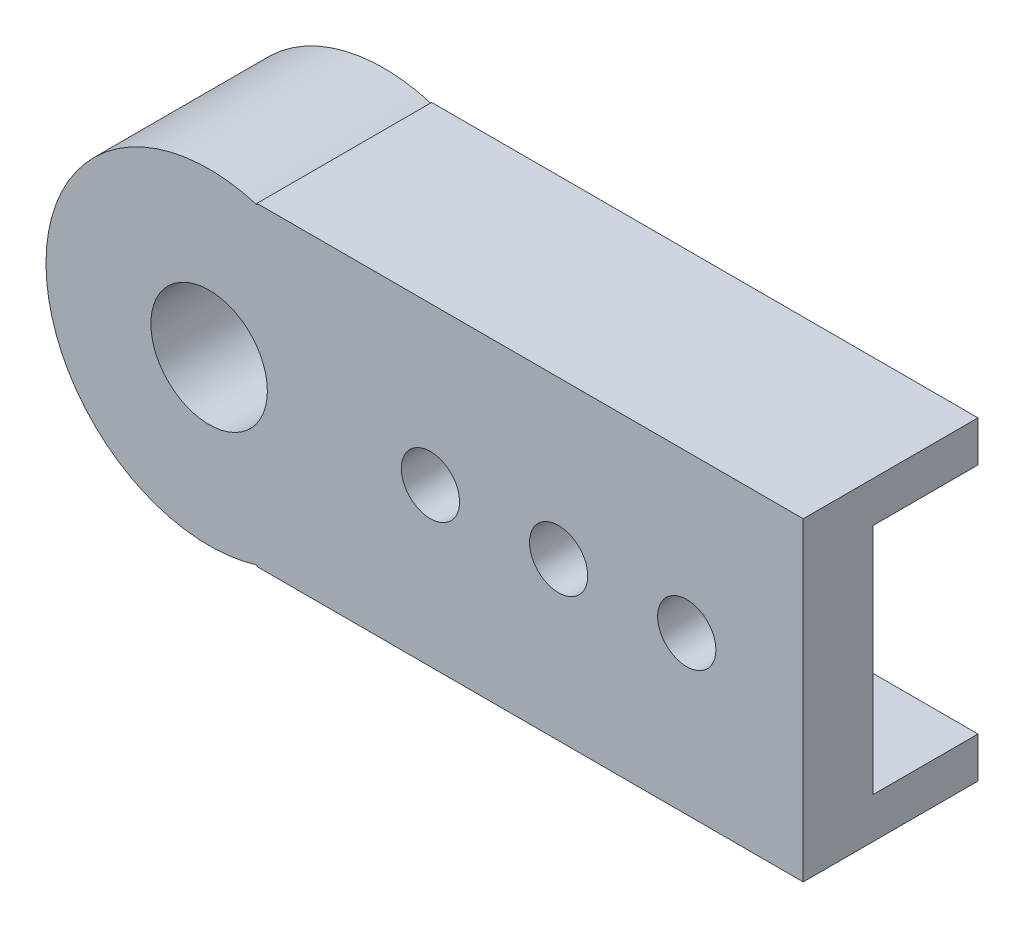
ISO-10303-21;
HEADER;
FILE_DESCRIPTION(('STEP AP214'),'2;1');
FILE_NAME('part.step','',(''),(''),'','','');
FILE_SCHEMA(('AUTOMOTIVE_DESIGN { 1 0 10303 214 1 1 1 1 }'));
ENDSEC;
DATA;
#1=APPLICATION_CONTEXT('core data for automotive mechanical design processes');
#2=APPLICATION_PROTOCOL_DEFINITION('international standard','automotive_design',2000,#1);
#3=PRODUCT_CONTEXT('',#1,'mechanical');
#4=PRODUCT('Part','Part','',(#3));
#5=PRODUCT_RELATED_PRODUCT_CATEGORY('part','',(#4));
#6=PRODUCT_DEFINITION_FORMATION('','',#4);
#7=PRODUCT_DEFINITION_CONTEXT('part definition',#1,'design');
#8=PRODUCT_DEFINITION('design','',#6,#7);
#9=PRODUCT_DEFINITION_SHAPE('','',#8);
#10=(LENGTH_UNIT() NAMED_UNIT(*) SI_UNIT(.MILLI.,.METRE.));
#11=(NAMED_UNIT(*) PLANE_ANGLE_UNIT() SI_UNIT($,.RADIAN.));
#12=(NAMED_UNIT(*) SI_UNIT($,.STERADIAN.) SOLID_ANGLE_UNIT());
#13=UNCERTAINTY_MEASURE_WITH_UNIT(LENGTH_MEASURE(1.E-05),#10,'distance_accuracy_value','');
#14=(GEOMETRIC_REPRESENTATION_CONTEXT(3) GLOBAL_UNCERTAINTY_ASSIGNED_CONTEXT((#13)) GLOBAL_UNIT_ASSIGNED_CONTEXT((#10,
#11,#12)) REPRESENTATION_CONTEXT('',''));
#15=CARTESIAN_POINT('',(0.,0.,0.));
#16=DIRECTION('',(0.,0.,1.));
#17=DIRECTION('',(1.,0.,0.));
#18=AXIS2_PLACEMENT_3D('',#15,#16,#17);
#19=CARTESIAN_POINT('',(-31.,0.,-9.));
#20=DIRECTION('',(0.,0.,1.));
#21=DIRECTION('',(1.,0.,0.));
#22=AXIS2_PLACEMENT_3D('',#19,#20,#21);
#23=CYLINDRICAL_SURFACE('',#22,11.);
#24=CARTESIAN_POINT('',(-31.,0.,-9.));
#25=DIRECTION('',(0.,0.,1.));
#26=DIRECTION('',(1.,0.,0.));
#27=AXIS2_PLACEMENT_3D('',#24,#25,#26);
#28=CIRCLE('',#27,11.);
#29=CARTESIAN_POINT('',(-20.,0.,-9.));
#30=VERTEX_POINT('',#29);
#31=EDGE_CURVE('E161',#30,#30,#28,.T.);
#32=ORIENTED_EDGE('',*,*,#31,.F.);
#33=EDGE_LOOP('',(#32));
#34=FACE_BOUND('',#33,.T.);
#35=CARTESIAN_POINT('',(-31.,0.,-2.));
#36=DIRECTION('',(0.,0.,1.));
#37=DIRECTION('',(1.,0.,0.));
#38=AXIS2_PLACEMENT_3D('',#35,#36,#37);
#39=CIRCLE('',#38,11.);
#40=CARTESIAN_POINT('',(-20.,0.,-2.));
#41=VERTEX_POINT('',#40);
#42=EDGE_CURVE('E11',#41,#41,#39,.F.);
#43=ORIENTED_EDGE('',*,*,#42,.F.);
#44=EDGE_LOOP('',(#43));
#45=FACE_BOUND('',#44,.T.);
#46=ADVANCED_FACE('F45',(#34,#45),#23,.F.);
#47=CARTESIAN_POINT('',(20.,-10.,6.));
#48=DIRECTION('',(-1.,0.,0.));
#49=DIRECTION('',(0.,0.,1.));
#50=AXIS2_PLACEMENT_3D('',#47,#48,#49);
#51=PLANE('',#50);
#52=DIRECTION('',(0.,1.,0.));
#53=VECTOR('',#52,1.);
#54=CARTESIAN_POINT('',(20.,-10.,0.));
#55=LINE('',#54,#53);
#56=CARTESIAN_POINT('',(20.,-10.,0.));
#57=VERTEX_POINT('',#56);
#58=CARTESIAN_POINT('',(20.,10.,0.));
#59=VERTEX_POINT('',#58);
#60=EDGE_CURVE('E293',#57,#59,#55,.T.);
#61=ORIENTED_EDGE('',*,*,#60,.T.);
#62=DIRECTION('',(0.,0.,1.));
#63=VECTOR('',#62,1.);
#64=CARTESIAN_POINT('',(20.,10.,-9.));
#65=LINE('',#64,#63);
#66=CARTESIAN_POINT('',(20.,10.,-9.));
#67=VERTEX_POINT('',#66);
#68=EDGE_CURVE('E254',#67,#59,#65,.T.);
#69=ORIENTED_EDGE('',*,*,#68,.F.);
#70=DIRECTION('',(0.,-1.,0.));
#71=VECTOR('',#70,1.);
#72=CARTESIAN_POINT('',(20.,0.,-9.));
#73=LINE('',#72,#71);
#74=CARTESIAN_POINT('',(20.,13.5,-9.));
#75=VERTEX_POINT('',#74);
#76=EDGE_CURVE('E171',#75,#67,#73,.T.);
#77=ORIENTED_EDGE('',*,*,#76,.F.);
#78=DIRECTION('',(0.,0.,1.));
#79=VECTOR('',#78,1.);
#80=CARTESIAN_POINT('',(20.,13.5,-9.));
#81=LINE('',#80,#79);
#82=CARTESIAN_POINT('',(20.,13.5,6.));
#83=VERTEX_POINT('',#82);
#84=EDGE_CURVE('E250',#75,#83,#81,.T.);
#85=ORIENTED_EDGE('',*,*,#84,.T.);
#86=DIRECTION('',(0.,1.,0.));
#87=VECTOR('',#86,1.);
#88=CARTESIAN_POINT('',(20.,-10.,6.));
#89=LINE('',#88,#87);
#90=CARTESIAN_POINT('',(20.,-13.5,6.));
#91=VERTEX_POINT('',#90);
#92=EDGE_CURVE('E283',#91,#83,#89,.T.);
#93=ORIENTED_EDGE('',*,*,#92,.F.);
#94=DIRECTION('',(0.,0.,1.));
#95=VECTOR('',#94,1.);
#96=CARTESIAN_POINT('',(20.,-13.5,-9.));
#97=LINE('',#96,#95);
#98=CARTESIAN_POINT('',(20.,-13.5,-9.));
#99=VERTEX_POINT('',#98);
#100=EDGE_CURVE('E233',#99,#91,#97,.T.);
#101=ORIENTED_EDGE('',*,*,#100,.F.);
#102=DIRECTION('',(0.,-1.,0.));
#103=VECTOR('',#102,1.);
#104=CARTESIAN_POINT('',(20.,0.,-9.));
#105=LINE('',#104,#103);
#106=CARTESIAN_POINT('',(20.,-10.,-9.));
#107=VERTEX_POINT('',#106);
#108=EDGE_CURVE('E192',#107,#99,#105,.T.);
#109=ORIENTED_EDGE('',*,*,#108,.F.);
#110=DIRECTION('',(0.,0.,1.));
#111=VECTOR('',#110,1.);
#112=CARTESIAN_POINT('',(20.,-10.,-9.));
#113=LINE('',#112,#111);
#114=EDGE_CURVE('E229',#107,#57,#113,.T.);
#115=ORIENTED_EDGE('',*,*,#114,.T.);
#116=EDGE_LOOP('',(#61,#69,#77,#85,#93,#101,#109,#115));
#117=FACE_BOUND('',#116,.T.);
#118=ADVANCED_FACE('F47',(#117),#51,.F.);
#119=CARTESIAN_POINT('',(0.,0.,6.));
#120=DIRECTION('',(0.,0.,1.));
#121=DIRECTION('',(1.,0.,0.));
#122=AXIS2_PLACEMENT_3D('',#119,#120,#121);
#123=PLANE('',#122);
#124=DIRECTION('',(-1.,0.,0.));
#125=VECTOR('',#124,1.);
#126=CARTESIAN_POINT('',(0.,-13.5,6.));
#127=LINE('',#126,#125);
#128=CARTESIAN_POINT('',(-26.8939671408107,-13.5,6.));
#129=VERTEX_POINT('',#128);
#130=EDGE_CURVE('E165',#91,#129,#127,.T.);
#131=ORIENTED_EDGE('',*,*,#130,.F.);
#132=ORIENTED_EDGE('',*,*,#92,.T.);
#133=DIRECTION('',(-1.,0.,0.));
#134=VECTOR('',#133,1.);
#135=CARTESIAN_POINT('',(0.,13.5,6.));
#136=LINE('',#135,#134);
#137=CARTESIAN_POINT('',(-26.8939671408107,13.5,6.));
#138=VERTEX_POINT('',#137);
#139=EDGE_CURVE('E202',#83,#138,#136,.T.);
#140=ORIENTED_EDGE('',*,*,#139,.T.);
#141=DIRECTION('',(0.,1.,0.));
#142=VECTOR('',#141,1.);
#143=CARTESIAN_POINT('',(-26.8939671408107,0.,6.));
#144=LINE('',#143,#142);
#145=CARTESIAN_POINT('',(-26.8939671408107,13.3843376436512,6.));
#146=VERTEX_POINT('',#145);
#147=EDGE_CURVE('E206',#146,#138,#144,.T.);
#148=ORIENTED_EDGE('',*,*,#147,.F.);
#149=CARTESIAN_POINT('',(-31.,0.,6.));
#150=DIRECTION('',(0.,0.,1.));
#151=DIRECTION('',(1.,0.,0.));
#152=AXIS2_PLACEMENT_3D('',#149,#150,#151);
#153=CIRCLE('',#152,14.);
#154=CARTESIAN_POINT('',(-26.8939671408107,-13.3843376436512,6.));
#155=VERTEX_POINT('',#154);
#156=EDGE_CURVE('E211',#146,#155,#153,.T.);
#157=ORIENTED_EDGE('',*,*,#156,.T.);
#158=DIRECTION('',(0.,1.,0.));
#159=VECTOR('',#158,1.);
#160=CARTESIAN_POINT('',(-26.8939671408107,0.,6.));
#161=LINE('',#160,#159);
#162=EDGE_CURVE('E215',#129,#155,#161,.T.);
#163=ORIENTED_EDGE('',*,*,#162,.F.);
#164=EDGE_LOOP('',(#131,#132,#140,#148,#157,#163));
#165=FACE_BOUND('',#164,.T.);
#166=CARTESIAN_POINT('',(10.,0.,6.));
#167=DIRECTION('',(0.,0.,1.));
#168=DIRECTION('',(1.,0.,0.));
#169=AXIS2_PLACEMENT_3D('',#166,#167,#168);
#170=CIRCLE('',#169,2.5);
#171=CARTESIAN_POINT('',(12.5,0.,6.));
#172=VERTEX_POINT('',#171);
#173=EDGE_CURVE('E264',#172,#172,#170,.T.);
#174=ORIENTED_EDGE('',*,*,#173,.F.);
#175=EDGE_LOOP('',(#174));
#176=FACE_BOUND('',#175,.T.);
#177=CARTESIAN_POINT('',(-0.999999999999999,0.,6.));
#178=DIRECTION('',(0.,0.,1.));
#179=DIRECTION('',(1.,0.,0.));
#180=AXIS2_PLACEMENT_3D('',#177,#178,#179);
#181=CIRCLE('',#180,2.5);
#182=CARTESIAN_POINT('',(1.5,0.,6.));
#183=VERTEX_POINT('',#182);
#184=EDGE_CURVE('E268',#183,#183,#181,.T.);
#185=ORIENTED_EDGE('',*,*,#184,.F.);
#186=EDGE_LOOP('',(#185));
#187=FACE_BOUND('',#186,.T.);
#188=CARTESIAN_POINT('',(-12.,-1.53625178909098E-13,6.));
#189=DIRECTION('',(0.,0.,1.));
#190=DIRECTION('',(1.,0.,0.));
#191=AXIS2_PLACEMENT_3D('',#188,#189,#190);
#192=CIRCLE('',#191,2.5);
#193=CARTESIAN_POINT('',(-9.5,-1.53625178909098E-13,6.));
#194=VERTEX_POINT('',#193);
#195=EDGE_CURVE('E276',#194,#194,#192,.T.);
#196=ORIENTED_EDGE('',*,*,#195,.F.);
#197=EDGE_LOOP('',(#196));
#198=FACE_BOUND('',#197,.T.);
#199=CARTESIAN_POINT('',(-31.,0.,6.));
#200=DIRECTION('',(0.,0.,1.));
#201=DIRECTION('',(1.,0.,0.));
#202=AXIS2_PLACEMENT_3D('',#199,#200,#201);
#203=CIRCLE('',#202,5.);
#204=CARTESIAN_POINT('',(-26.,0.,6.));
#205=VERTEX_POINT('',#204);
#206=EDGE_CURVE('E382',#205,#205,#203,.T.);
#207=ORIENTED_EDGE('',*,*,#206,.F.);
#208=EDGE_LOOP('',(#207));
#209=FACE_BOUND('',#208,.T.);
#210=ADVANCED_FACE('F348',(#165,#176,#187,#198,#209),#123,.T.);
#211=CARTESIAN_POINT('',(0.,0.,0.));
#212=DIRECTION('',(0.,0.,1.));
#213=DIRECTION('',(1.,0.,0.));
#214=AXIS2_PLACEMENT_3D('',#211,#212,#213);
#215=PLANE('',#214);
#216=CARTESIAN_POINT('',(10.,0.,0.));
#217=DIRECTION('',(0.,0.,1.));
#218=DIRECTION('',(1.,0.,0.));
#219=AXIS2_PLACEMENT_3D('',#216,#217,#218);
#220=CIRCLE('',#219,2.5);
#221=CARTESIAN_POINT('',(12.5,0.,0.));
#222=VERTEX_POINT('',#221);
#223=EDGE_CURVE('E260',#222,#222,#220,.T.);
#224=ORIENTED_EDGE('',*,*,#223,.T.);
#225=EDGE_LOOP('',(#224));
#226=FACE_BOUND('',#225,.T.);
#227=CARTESIAN_POINT('',(-0.999999999999999,0.,0.));
#228=DIRECTION('',(0.,0.,1.));
#229=DIRECTION('',(1.,0.,0.));
#230=AXIS2_PLACEMENT_3D('',#227,#228,#229);
#231=CIRCLE('',#230,2.5);
#232=CARTESIAN_POINT('',(1.5,0.,0.));
#233=VERTEX_POINT('',#232);
#234=EDGE_CURVE('E272',#233,#233,#231,.T.);
#235=ORIENTED_EDGE('',*,*,#234,.T.);
#236=EDGE_LOOP('',(#235));
#237=FACE_BOUND('',#236,.T.);
#238=CARTESIAN_POINT('',(-12.,-1.53625178909098E-13,0.));
#239=DIRECTION('',(0.,0.,1.));
#240=DIRECTION('',(1.,0.,0.));
#241=AXIS2_PLACEMENT_3D('',#238,#239,#240);
#242=CIRCLE('',#241,2.5);
#243=CARTESIAN_POINT('',(-9.5,-1.53625178909098E-13,0.));
#244=VERTEX_POINT('',#243);
#245=EDGE_CURVE('E224',#244,#244,#242,.T.);
#246=ORIENTED_EDGE('',*,*,#245,.T.);
#247=EDGE_LOOP('',(#246));
#248=FACE_BOUND('',#247,.T.);
#249=DIRECTION('',(0.,-1.,0.));
#250=VECTOR('',#249,1.);
#251=CARTESIAN_POINT('',(-20.,-10.,0.));
#252=LINE('',#251,#250);
#253=CARTESIAN_POINT('',(-20.,-8.66025403784439,0.));
#254=VERTEX_POINT('',#253);
#255=CARTESIAN_POINT('',(-20.,-10.,0.));
#256=VERTEX_POINT('',#255);
#257=EDGE_CURVE('E61',#254,#256,#252,.T.);
#258=ORIENTED_EDGE('',*,*,#257,.F.);
#259=CARTESIAN_POINT('',(-31.,0.,0.));
#260=DIRECTION('',(0.,0.,1.));
#261=DIRECTION('',(1.,0.,0.));
#262=AXIS2_PLACEMENT_3D('',#259,#260,#261);
#263=CIRCLE('',#262,14.);
#264=CARTESIAN_POINT('',(-20.,8.66025403784439,0.));
#265=VERTEX_POINT('',#264);
#266=EDGE_CURVE('E54',#254,#265,#263,.T.);
#267=ORIENTED_EDGE('',*,*,#266,.T.);
#268=CARTESIAN_POINT('',(-20.,10.,0.));
#269=VERTEX_POINT('',#268);
#270=EDGE_CURVE('E67',#269,#265,#252,.T.);
#271=ORIENTED_EDGE('',*,*,#270,.F.);
#272=DIRECTION('',(-1.,0.,0.));
#273=VECTOR('',#272,1.);
#274=CARTESIAN_POINT('',(20.,10.,0.));
#275=LINE('',#274,#273);
#276=EDGE_CURVE('E286',#59,#269,#275,.T.);
#277=ORIENTED_EDGE('',*,*,#276,.F.);
#278=ORIENTED_EDGE('',*,*,#60,.F.);
#279=DIRECTION('',(1.,0.,0.));
#280=VECTOR('',#279,1.);
#281=CARTESIAN_POINT('',(20.,-10.,0.));
#282=LINE('',#281,#280);
#283=EDGE_CURVE('E289',#256,#57,#282,.T.);
#284=ORIENTED_EDGE('',*,*,#283,.F.);
#285=EDGE_LOOP('',(#258,#267,#271,#277,#278,#284));
#286=FACE_BOUND('',#285,.T.);
#287=ADVANCED_FACE('F298',(#226,#237,#248,#286),#215,.F.);
#288=CARTESIAN_POINT('',(-12.,-1.53625178909098E-13,0.));
#289=DIRECTION('',(0.,0.,1.));
#290=DIRECTION('',(1.,0.,0.));
#291=AXIS2_PLACEMENT_3D('',#288,#289,#290);
#292=CYLINDRICAL_SURFACE('',#291,2.5);
#293=ORIENTED_EDGE('',*,*,#245,.F.);
#294=EDGE_LOOP('',(#293));
#295=FACE_BOUND('',#294,.T.);
#296=ORIENTED_EDGE('',*,*,#195,.T.);
#297=EDGE_LOOP('',(#296));
#298=FACE_BOUND('',#297,.T.);
#299=ADVANCED_FACE('F360',(#295,#298),#292,.F.);
#300=CARTESIAN_POINT('',(-0.999999999999999,0.,0.));
#301=DIRECTION('',(0.,0.,1.));
#302=DIRECTION('',(1.,0.,0.));
#303=AXIS2_PLACEMENT_3D('',#300,#301,#302);
#304=CYLINDRICAL_SURFACE('',#303,2.5);
#305=ORIENTED_EDGE('',*,*,#234,.F.);
#306=EDGE_LOOP('',(#305));
#307=FACE_BOUND('',#306,.T.);
#308=ORIENTED_EDGE('',*,*,#184,.T.);
#309=EDGE_LOOP('',(#308));
#310=FACE_BOUND('',#309,.T.);
#311=ADVANCED_FACE('F356',(#307,#310),#304,.F.);
#312=CARTESIAN_POINT('',(10.,0.,0.));
#313=DIRECTION('',(0.,0.,1.));
#314=DIRECTION('',(1.,0.,0.));
#315=AXIS2_PLACEMENT_3D('',#312,#313,#314);
#316=CYLINDRICAL_SURFACE('',#315,2.5);
#317=ORIENTED_EDGE('',*,*,#223,.F.);
#318=EDGE_LOOP('',(#317));
#319=FACE_BOUND('',#318,.T.);
#320=ORIENTED_EDGE('',*,*,#173,.T.);
#321=EDGE_LOOP('',(#320));
#322=FACE_BOUND('',#321,.T.);
#323=ADVANCED_FACE('F353',(#319,#322),#316,.F.);
#324=CARTESIAN_POINT('',(-31.,0.,-9.));
#325=DIRECTION('',(0.,0.,1.));
#326=DIRECTION('',(1.,0.,0.));
#327=AXIS2_PLACEMENT_3D('',#324,#325,#326);
#328=CYLINDRICAL_SURFACE('',#327,14.);
#329=ORIENTED_EDGE('',*,*,#266,.F.);
#330=DIRECTION('',(0.,0.,1.));
#331=VECTOR('',#330,1.);
#332=CARTESIAN_POINT('',(-20.,-8.66025403784439,-9.));
#333=LINE('',#332,#331);
#334=CARTESIAN_POINT('',(-20.,-8.66025403784439,-9.));
#335=VERTEX_POINT('',#334);
#336=EDGE_CURVE('E158',#335,#254,#333,.T.);
#337=ORIENTED_EDGE('',*,*,#336,.F.);
#338=CARTESIAN_POINT('',(-31.,0.,-9.));
#339=DIRECTION('',(0.,0.,1.));
#340=DIRECTION('',(1.,0.,0.));
#341=AXIS2_PLACEMENT_3D('',#338,#339,#340);
#342=CIRCLE('',#341,14.);
#343=CARTESIAN_POINT('',(-20.,8.66025403784439,-9.));
#344=VERTEX_POINT('',#343);
#345=EDGE_CURVE('E140',#335,#344,#342,.T.);
#346=ORIENTED_EDGE('',*,*,#345,.T.);
#347=DIRECTION('',(0.,0.,1.));
#348=VECTOR('',#347,1.);
#349=CARTESIAN_POINT('',(-20.,8.66025403784439,-9.));
#350=LINE('',#349,#348);
#351=EDGE_CURVE('E149',#344,#265,#350,.T.);
#352=ORIENTED_EDGE('',*,*,#351,.T.);
#353=EDGE_LOOP('',(#329,#337,#346,#352));
#354=FACE_BOUND('',#353,.T.);
#355=ADVANCED_FACE('F156',(#354),#328,.T.);
#356=CARTESIAN_POINT('',(-20.,0.,-9.));
#357=DIRECTION('',(-1.,0.,0.));
#358=DIRECTION('',(0.,0.,1.));
#359=AXIS2_PLACEMENT_3D('',#356,#357,#358);
#360=PLANE('',#359);
#361=ORIENTED_EDGE('',*,*,#336,.T.);
#362=ORIENTED_EDGE('',*,*,#257,.T.);
#363=DIRECTION('',(0.,0.,1.));
#364=VECTOR('',#363,1.);
#365=CARTESIAN_POINT('',(-20.,-10.,-9.));
#366=LINE('',#365,#364);
#367=CARTESIAN_POINT('',(-20.,-10.,-9.));
#368=VERTEX_POINT('',#367);
#369=EDGE_CURVE('E225',#368,#256,#366,.T.);
#370=ORIENTED_EDGE('',*,*,#369,.F.);
#371=DIRECTION('',(0.,-1.,0.));
#372=VECTOR('',#371,1.);
#373=CARTESIAN_POINT('',(-20.,0.,-9.));
#374=LINE('',#373,#372);
#375=EDGE_CURVE('E154',#335,#368,#374,.T.);
#376=ORIENTED_EDGE('',*,*,#375,.F.);
#377=EDGE_LOOP('',(#361,#362,#370,#376));
#378=FACE_BOUND('',#377,.T.);
#379=ADVANCED_FACE('F300',(#378),#360,.F.);
#380=CARTESIAN_POINT('',(0.,-10.,-9.));
#381=DIRECTION('',(0.,-1.,0.));
#382=DIRECTION('',(1.,0.,0.));
#383=AXIS2_PLACEMENT_3D('',#380,#381,#382);
#384=PLANE('',#383);
#385=ORIENTED_EDGE('',*,*,#369,.T.);
#386=ORIENTED_EDGE('',*,*,#283,.T.);
#387=ORIENTED_EDGE('',*,*,#114,.F.);
#388=DIRECTION('',(1.,0.,0.));
#389=VECTOR('',#388,1.);
#390=CARTESIAN_POINT('',(0.,-10.,-9.));
#391=LINE('',#390,#389);
#392=EDGE_CURVE('E196',#368,#107,#391,.T.);
#393=ORIENTED_EDGE('',*,*,#392,.F.);
#394=EDGE_LOOP('',(#385,#386,#387,#393));
#395=FACE_BOUND('',#394,.T.);
#396=ADVANCED_FACE('F305',(#395),#384,.F.);
#397=CARTESIAN_POINT('',(0.,10.,-9.));
#398=DIRECTION('',(0.,1.,0.));
#399=DIRECTION('',(-1.,0.,0.));
#400=AXIS2_PLACEMENT_3D('',#397,#398,#399);
#401=PLANE('',#400);
#402=ORIENTED_EDGE('',*,*,#68,.T.);
#403=ORIENTED_EDGE('',*,*,#276,.T.);
#404=DIRECTION('',(0.,0.,1.));
#405=VECTOR('',#404,1.);
#406=CARTESIAN_POINT('',(-20.,10.,-9.));
#407=LINE('',#406,#405);
#408=CARTESIAN_POINT('',(-20.,10.,-9.));
#409=VERTEX_POINT('',#408);
#410=EDGE_CURVE('E153',#409,#269,#407,.T.);
#411=ORIENTED_EDGE('',*,*,#410,.F.);
#412=DIRECTION('',(-1.,0.,0.));
#413=VECTOR('',#412,1.);
#414=CARTESIAN_POINT('',(0.,10.,-9.));
#415=LINE('',#414,#413);
#416=EDGE_CURVE('E142',#67,#409,#415,.T.);
#417=ORIENTED_EDGE('',*,*,#416,.F.);
#418=EDGE_LOOP('',(#402,#403,#411,#417));
#419=FACE_BOUND('',#418,.T.);
#420=ADVANCED_FACE('F330',(#419),#401,.F.);
#421=CARTESIAN_POINT('',(-20.,0.,-9.));
#422=DIRECTION('',(-1.,0.,0.));
#423=DIRECTION('',(0.,0.,1.));
#424=AXIS2_PLACEMENT_3D('',#421,#422,#423);
#425=PLANE('',#424);
#426=ORIENTED_EDGE('',*,*,#410,.T.);
#427=ORIENTED_EDGE('',*,*,#270,.T.);
#428=ORIENTED_EDGE('',*,*,#351,.F.);
#429=DIRECTION('',(0.,-1.,0.));
#430=VECTOR('',#429,1.);
#431=CARTESIAN_POINT('',(-20.,0.,-9.));
#432=LINE('',#431,#430);
#433=EDGE_CURVE('E135',#409,#344,#432,.T.);
#434=ORIENTED_EDGE('',*,*,#433,.F.);
#435=EDGE_LOOP('',(#426,#427,#428,#434));
#436=FACE_BOUND('',#435,.T.);
#437=ADVANCED_FACE('F150',(#436),#425,.F.);
#438=CARTESIAN_POINT('',(0.,-13.5,-9.));
#439=DIRECTION('',(0.,1.,0.));
#440=DIRECTION('',(0.,0.,1.));
#441=AXIS2_PLACEMENT_3D('',#438,#439,#440);
#442=PLANE('',#441);
#443=ORIENTED_EDGE('',*,*,#130,.T.);
#444=DIRECTION('',(0.,0.,1.));
#445=VECTOR('',#444,1.);
#446=CARTESIAN_POINT('',(-26.8939671408107,-13.5,-9.));
#447=LINE('',#446,#445);
#448=CARTESIAN_POINT('',(-26.8939671408107,-13.5,-9.));
#449=VERTEX_POINT('',#448);
#450=EDGE_CURVE('E237',#449,#129,#447,.T.);
#451=ORIENTED_EDGE('',*,*,#450,.F.);
#452=DIRECTION('',(-1.,0.,0.));
#453=VECTOR('',#452,1.);
#454=CARTESIAN_POINT('',(0.,-13.5,-9.));
#455=LINE('',#454,#453);
#456=EDGE_CURVE('E188',#99,#449,#455,.T.);
#457=ORIENTED_EDGE('',*,*,#456,.F.);
#458=ORIENTED_EDGE('',*,*,#100,.T.);
#459=EDGE_LOOP('',(#443,#451,#457,#458));
#460=FACE_BOUND('',#459,.T.);
#461=ADVANCED_FACE('F310',(#460),#442,.F.);
#462=CARTESIAN_POINT('',(-26.8939671408107,0.,-9.));
#463=DIRECTION('',(1.,0.,0.));
#464=DIRECTION('',(0.,0.,-1.));
#465=AXIS2_PLACEMENT_3D('',#462,#463,#464);
#466=PLANE('',#465);
#467=ORIENTED_EDGE('',*,*,#162,.T.);
#468=DIRECTION('',(0.,0.,1.));
#469=VECTOR('',#468,1.);
#470=CARTESIAN_POINT('',(-26.8939671408107,-13.3843376436512,-9.));
#471=LINE('',#470,#469);
#472=CARTESIAN_POINT('',(-26.8939671408107,-13.3843376436512,-9.));
#473=VERTEX_POINT('',#472);
#474=EDGE_CURVE('E241',#473,#155,#471,.T.);
#475=ORIENTED_EDGE('',*,*,#474,.F.);
#476=DIRECTION('',(0.,1.,0.));
#477=VECTOR('',#476,1.);
#478=CARTESIAN_POINT('',(-26.8939671408107,0.,-9.));
#479=LINE('',#478,#477);
#480=EDGE_CURVE('E185',#449,#473,#479,.T.);
#481=ORIENTED_EDGE('',*,*,#480,.F.);
#482=ORIENTED_EDGE('',*,*,#450,.T.);
#483=EDGE_LOOP('',(#467,#475,#481,#482));
#484=FACE_BOUND('',#483,.T.);
#485=ADVANCED_FACE('F315',(#484),#466,.F.);
#486=CARTESIAN_POINT('',(-31.,0.,-9.));
#487=DIRECTION('',(0.,0.,1.));
#488=DIRECTION('',(1.,0.,0.));
#489=AXIS2_PLACEMENT_3D('',#486,#487,#488);
#490=CYLINDRICAL_SURFACE('',#489,14.);
#491=ORIENTED_EDGE('',*,*,#156,.F.);
#492=DIRECTION('',(0.,0.,1.));
#493=VECTOR('',#492,1.);
#494=CARTESIAN_POINT('',(-26.8939671408107,13.3843376436512,-9.));
#495=LINE('',#494,#493);
#496=CARTESIAN_POINT('',(-26.8939671408107,13.3843376436512,-9.));
#497=VERTEX_POINT('',#496);
#498=EDGE_CURVE('E244',#497,#146,#495,.T.);
#499=ORIENTED_EDGE('',*,*,#498,.F.);
#500=CARTESIAN_POINT('',(-31.,0.,-9.));
#501=DIRECTION('',(0.,0.,1.));
#502=DIRECTION('',(1.,0.,0.));
#503=AXIS2_PLACEMENT_3D('',#500,#501,#502);
#504=CIRCLE('',#503,14.);
#505=EDGE_CURVE('E181',#497,#473,#504,.T.);
#506=ORIENTED_EDGE('',*,*,#505,.T.);
#507=ORIENTED_EDGE('',*,*,#474,.T.);
#508=EDGE_LOOP('',(#491,#499,#506,#507));
#509=FACE_BOUND('',#508,.T.);
#510=ADVANCED_FACE('F318',(#509),#490,.T.);
#511=CARTESIAN_POINT('',(-26.8939671408107,0.,-9.));
#512=DIRECTION('',(1.,0.,0.));
#513=DIRECTION('',(0.,0.,-1.));
#514=AXIS2_PLACEMENT_3D('',#511,#512,#513);
#515=PLANE('',#514);
#516=ORIENTED_EDGE('',*,*,#147,.T.);
#517=DIRECTION('',(0.,0.,1.));
#518=VECTOR('',#517,1.);
#519=CARTESIAN_POINT('',(-26.8939671408107,13.5,-9.));
#520=LINE('',#519,#518);
#521=CARTESIAN_POINT('',(-26.8939671408107,13.5,-9.));
#522=VERTEX_POINT('',#521);
#523=EDGE_CURVE('E247',#522,#138,#520,.T.);
#524=ORIENTED_EDGE('',*,*,#523,.F.);
#525=DIRECTION('',(0.,1.,0.));
#526=VECTOR('',#525,1.);
#527=CARTESIAN_POINT('',(-26.8939671408107,0.,-9.));
#528=LINE('',#527,#526);
#529=EDGE_CURVE('E178',#497,#522,#528,.T.);
#530=ORIENTED_EDGE('',*,*,#529,.F.);
#531=ORIENTED_EDGE('',*,*,#498,.T.);
#532=EDGE_LOOP('',(#516,#524,#530,#531));
#533=FACE_BOUND('',#532,.T.);
#534=ADVANCED_FACE('F323',(#533),#515,.F.);
#535=CARTESIAN_POINT('',(0.,13.5,-9.));
#536=DIRECTION('',(0.,1.,0.));
#537=DIRECTION('',(-1.,0.,0.));
#538=AXIS2_PLACEMENT_3D('',#535,#536,#537);
#539=PLANE('',#538);
#540=ORIENTED_EDGE('',*,*,#139,.F.);
#541=ORIENTED_EDGE('',*,*,#84,.F.);
#542=DIRECTION('',(-1.,0.,0.));
#543=VECTOR('',#542,1.);
#544=CARTESIAN_POINT('',(0.,13.5,-9.));
#545=LINE('',#544,#543);
#546=EDGE_CURVE('E174',#75,#522,#545,.T.);
#547=ORIENTED_EDGE('',*,*,#546,.T.);
#548=ORIENTED_EDGE('',*,*,#523,.T.);
#549=EDGE_LOOP('',(#540,#541,#547,#548));
#550=FACE_BOUND('',#549,.T.);
#551=ADVANCED_FACE('F328',(#550),#539,.T.);
#552=CARTESIAN_POINT('',(0.,0.,-9.));
#553=DIRECTION('',(0.,0.,1.));
#554=DIRECTION('',(1.,0.,0.));
#555=AXIS2_PLACEMENT_3D('',#552,#553,#554);
#556=PLANE('',#555);
#557=ORIENTED_EDGE('',*,*,#31,.T.);
#558=EDGE_LOOP('',(#557));
#559=FACE_BOUND('',#558,.T.);
#560=ORIENTED_EDGE('',*,*,#345,.F.);
#561=ORIENTED_EDGE('',*,*,#375,.T.);
#562=ORIENTED_EDGE('',*,*,#392,.T.);
#563=ORIENTED_EDGE('',*,*,#108,.T.);
#564=ORIENTED_EDGE('',*,*,#456,.T.);
#565=ORIENTED_EDGE('',*,*,#480,.T.);
#566=ORIENTED_EDGE('',*,*,#505,.F.);
#567=ORIENTED_EDGE('',*,*,#529,.T.);
#568=ORIENTED_EDGE('',*,*,#546,.F.);
#569=ORIENTED_EDGE('',*,*,#76,.T.);
#570=ORIENTED_EDGE('',*,*,#416,.T.);
#571=ORIENTED_EDGE('',*,*,#433,.T.);
#572=EDGE_LOOP('',(#560,#561,#562,#563,#564,#565,#566,#567,#568,#569,#570,#571));
#573=FACE_BOUND('',#572,.T.);
#574=ADVANCED_FACE('F137',(#559,#573),#556,.F.);
#575=CARTESIAN_POINT('',(-31.,0.,-2.));
#576=DIRECTION('',(0.,0.,1.));
#577=DIRECTION('',(1.,0.,0.));
#578=AXIS2_PLACEMENT_3D('',#575,#576,#577);
#579=PLANE('',#578);
#580=CARTESIAN_POINT('',(-31.,0.,-2.));
#581=DIRECTION('',(0.,0.,1.));
#582=DIRECTION('',(1.,0.,0.));
#583=AXIS2_PLACEMENT_3D('',#580,#581,#582);
#584=CIRCLE('',#583,5.);
#585=CARTESIAN_POINT('',(-26.,0.,-2.));
#586=VERTEX_POINT('',#585);
#587=EDGE_CURVE('E207',#586,#586,#584,.T.);
#588=ORIENTED_EDGE('',*,*,#587,.T.);
#589=EDGE_LOOP('',(#588));
#590=FACE_BOUND('',#589,.T.);
#591=ORIENTED_EDGE('',*,*,#42,.T.);
#592=EDGE_LOOP('',(#591));
#593=FACE_BOUND('',#592,.T.);
#594=ADVANCED_FACE('F390',(#590,#593),#579,.F.);
#595=CARTESIAN_POINT('',(-31.,0.,-2.));
#596=DIRECTION('',(0.,0.,1.));
#597=DIRECTION('',(1.,0.,0.));
#598=AXIS2_PLACEMENT_3D('',#595,#596,#597);
#599=CYLINDRICAL_SURFACE('',#598,5.);
#600=ORIENTED_EDGE('',*,*,#587,.F.);
#601=EDGE_LOOP('',(#600));
#602=FACE_BOUND('',#601,.T.);
#603=ORIENTED_EDGE('',*,*,#206,.T.);
#604=EDGE_LOOP('',(#603));
#605=FACE_BOUND('',#604,.T.);
#606=ADVANCED_FACE('F393',(#602,#605),#599,.F.);
#607=CLOSED_SHELL('',(#46,#118,#210,#287,#299,#311,#323,#355,#379,#396,#420,#437,#461,#485,#510,
#534,#551,#574,#594,#606));
#608=MANIFOLD_SOLID_BREP('B2',#607);
#609=ADVANCED_BREP_SHAPE_REPRESENTATION('',(#18,#608),#14);
#610=SHAPE_DEFINITION_REPRESENTATION(#9,#609);
ENDSEC;
END-ISO-10303-21;
